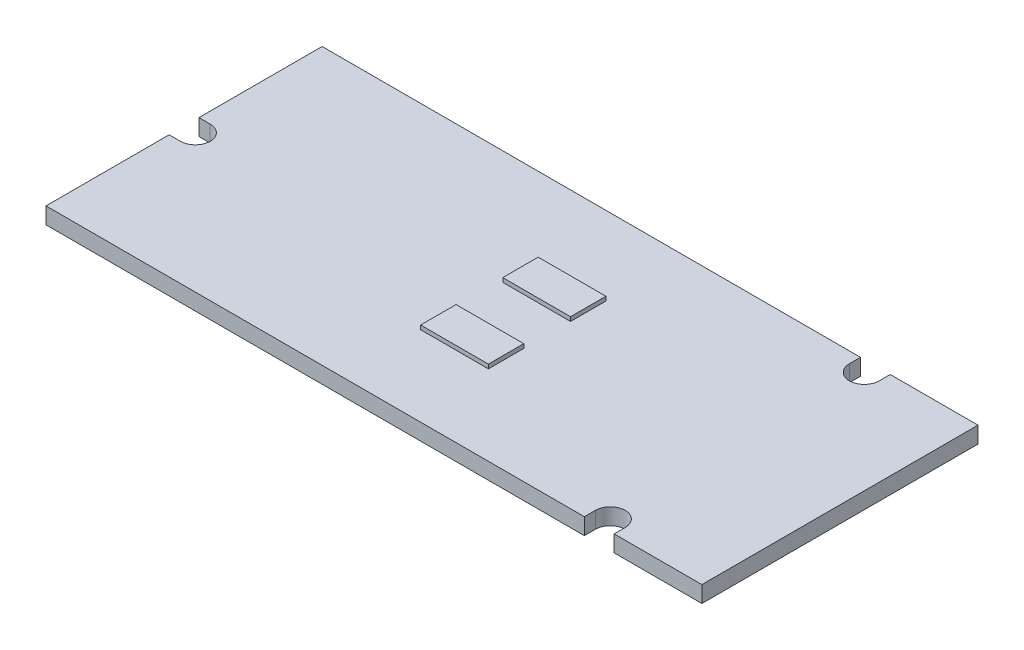
ISO-10303-21;
HEADER;
FILE_DESCRIPTION(('STEP AP214'),'2;1');
FILE_NAME('part.step','',(''),(''),'','','');
FILE_SCHEMA(('AUTOMOTIVE_DESIGN { 1 0 10303 214 1 1 1 1 }'));
ENDSEC;
DATA;
#1=APPLICATION_CONTEXT('core data for automotive mechanical design processes');
#2=APPLICATION_PROTOCOL_DEFINITION('international standard','automotive_design',2000,#1);
#3=PRODUCT_CONTEXT('',#1,'mechanical');
#4=PRODUCT('Part','Part','',(#3));
#5=PRODUCT_RELATED_PRODUCT_CATEGORY('part','',(#4));
#6=PRODUCT_DEFINITION_FORMATION('','',#4);
#7=PRODUCT_DEFINITION_CONTEXT('part definition',#1,'design');
#8=PRODUCT_DEFINITION('design','',#6,#7);
#9=PRODUCT_DEFINITION_SHAPE('','',#8);
#10=(LENGTH_UNIT() NAMED_UNIT(*) SI_UNIT(.MILLI.,.METRE.));
#11=(NAMED_UNIT(*) PLANE_ANGLE_UNIT() SI_UNIT($,.RADIAN.));
#12=(NAMED_UNIT(*) SI_UNIT($,.STERADIAN.) SOLID_ANGLE_UNIT());
#13=UNCERTAINTY_MEASURE_WITH_UNIT(LENGTH_MEASURE(1.E-05),#10,'distance_accuracy_value','');
#14=(GEOMETRIC_REPRESENTATION_CONTEXT(3) GLOBAL_UNCERTAINTY_ASSIGNED_CONTEXT((#13)) GLOBAL_UNIT_ASSIGNED_CONTEXT((#10,
#11,#12)) REPRESENTATION_CONTEXT('',''));
#15=CARTESIAN_POINT('',(0.,0.,0.));
#16=DIRECTION('',(0.,0.,1.));
#17=DIRECTION('',(1.,0.,0.));
#18=AXIS2_PLACEMENT_3D('',#15,#16,#17);
#19=CARTESIAN_POINT('',(21.95,1.6,-12.375));
#20=DIRECTION('',(0.,1.,0.));
#21=DIRECTION('',(0.,0.,1.));
#22=AXIS2_PLACEMENT_3D('',#19,#20,#21);
#23=PLANE('',#22);
#24=DIRECTION('',(-1.,0.,0.));
#25=VECTOR('',#24,1.);
#26=CARTESIAN_POINT('',(-3.24999999999999,1.6,-5.80000000000001));
#27=LINE('',#26,#25);
#28=CARTESIAN_POINT('',(3.35000000000001,1.6,-5.80000000000001));
#29=VERTEX_POINT('',#28);
#30=CARTESIAN_POINT('',(-3.24999999999999,1.6,-5.80000000000001));
#31=VERTEX_POINT('',#30);
#32=EDGE_CURVE('E223',#29,#31,#27,.T.);
#33=ORIENTED_EDGE('',*,*,#32,.F.);
#34=DIRECTION('',(0.,0.,-1.));
#35=VECTOR('',#34,1.);
#36=CARTESIAN_POINT('',(3.35000000000001,1.6,-2.35000000000001));
#37=LINE('',#36,#35);
#38=CARTESIAN_POINT('',(3.35000000000001,1.6,-2.35000000000001));
#39=VERTEX_POINT('',#38);
#40=EDGE_CURVE('E220',#39,#29,#37,.T.);
#41=ORIENTED_EDGE('',*,*,#40,.F.);
#42=DIRECTION('',(1.,0.,0.));
#43=VECTOR('',#42,1.);
#44=CARTESIAN_POINT('',(-3.24999999999999,1.6,-2.35000000000001));
#45=LINE('',#44,#43);
#46=CARTESIAN_POINT('',(-3.24999999999999,1.6,-2.35000000000001));
#47=VERTEX_POINT('',#46);
#48=EDGE_CURVE('E232',#47,#39,#45,.T.);
#49=ORIENTED_EDGE('',*,*,#48,.F.);
#50=DIRECTION('',(0.,0.,1.));
#51=VECTOR('',#50,1.);
#52=CARTESIAN_POINT('',(-3.24999999999999,1.6,-2.35000000000001));
#53=LINE('',#52,#51);
#54=EDGE_CURVE('E240',#31,#47,#53,.T.);
#55=ORIENTED_EDGE('',*,*,#54,.F.);
#56=EDGE_LOOP('',(#33,#41,#49,#55));
#57=FACE_BOUND('',#56,.T.);
#58=DIRECTION('',(0.,0.,1.));
#59=VECTOR('',#58,1.);
#60=CARTESIAN_POINT('',(-31.95,1.6,-1.45));
#61=LINE('',#60,#59);
#62=CARTESIAN_POINT('',(-31.95,1.6,-13.45));
#63=VERTEX_POINT('',#62);
#64=CARTESIAN_POINT('',(-31.95,1.6,-1.45));
#65=VERTEX_POINT('',#64);
#66=EDGE_CURVE('E252',#63,#65,#61,.T.);
#67=ORIENTED_EDGE('',*,*,#66,.T.);
#68=DIRECTION('',(1.,0.,0.));
#69=VECTOR('',#68,1.);
#70=CARTESIAN_POINT('',(-30.85,1.6,-1.45));
#71=LINE('',#70,#69);
#72=CARTESIAN_POINT('',(-30.85,1.6,-1.45));
#73=VERTEX_POINT('',#72);
#74=EDGE_CURVE('E255',#65,#73,#71,.T.);
#75=ORIENTED_EDGE('',*,*,#74,.T.);
#76=CARTESIAN_POINT('',(-30.85,1.6,0.));
#77=DIRECTION('',(0.,-1.,0.));
#78=DIRECTION('',(0.,0.,1.));
#79=AXIS2_PLACEMENT_3D('',#76,#77,#78);
#80=CIRCLE('',#79,1.45);
#81=CARTESIAN_POINT('',(-30.85,1.6,1.45));
#82=VERTEX_POINT('',#81);
#83=EDGE_CURVE('E258',#73,#82,#80,.T.);
#84=ORIENTED_EDGE('',*,*,#83,.T.);
#85=DIRECTION('',(-1.,0.,0.));
#86=VECTOR('',#85,1.);
#87=CARTESIAN_POINT('',(-30.85,1.6,1.45));
#88=LINE('',#87,#86);
#89=CARTESIAN_POINT('',(-31.95,1.6,1.45));
#90=VERTEX_POINT('',#89);
#91=EDGE_CURVE('E260',#82,#90,#88,.T.);
#92=ORIENTED_EDGE('',*,*,#91,.T.);
#93=DIRECTION('',(0.,0.,1.));
#94=VECTOR('',#93,1.);
#95=CARTESIAN_POINT('',(-31.95,1.6,13.45));
#96=LINE('',#95,#94);
#97=CARTESIAN_POINT('',(-31.95,1.6,13.45));
#98=VERTEX_POINT('',#97);
#99=EDGE_CURVE('E262',#90,#98,#96,.T.);
#100=ORIENTED_EDGE('',*,*,#99,.T.);
#101=DIRECTION('',(1.,0.,0.));
#102=VECTOR('',#101,1.);
#103=CARTESIAN_POINT('',(20.5,1.6,13.45));
#104=LINE('',#103,#102);
#105=CARTESIAN_POINT('',(20.5,1.6,13.45));
#106=VERTEX_POINT('',#105);
#107=EDGE_CURVE('E264',#98,#106,#104,.T.);
#108=ORIENTED_EDGE('',*,*,#107,.T.);
#109=DIRECTION('',(0.,0.,-1.));
#110=VECTOR('',#109,1.);
#111=CARTESIAN_POINT('',(20.5,1.6,12.375));
#112=LINE('',#111,#110);
#113=CARTESIAN_POINT('',(20.5,1.6,12.375));
#114=VERTEX_POINT('',#113);
#115=EDGE_CURVE('E266',#106,#114,#112,.T.);
#116=ORIENTED_EDGE('',*,*,#115,.T.);
#117=CARTESIAN_POINT('',(21.95,1.6,12.375));
#118=DIRECTION('',(0.,-1.,0.));
#119=DIRECTION('',(0.,0.,-1.));
#120=AXIS2_PLACEMENT_3D('',#117,#118,#119);
#121=CIRCLE('',#120,1.45);
#122=CARTESIAN_POINT('',(23.4,1.6,12.375));
#123=VERTEX_POINT('',#122);
#124=EDGE_CURVE('E268',#114,#123,#121,.T.);
#125=ORIENTED_EDGE('',*,*,#124,.T.);
#126=DIRECTION('',(0.,0.,1.));
#127=VECTOR('',#126,1.);
#128=CARTESIAN_POINT('',(23.4,1.6,12.375));
#129=LINE('',#128,#127);
#130=CARTESIAN_POINT('',(23.4,1.6,13.45));
#131=VERTEX_POINT('',#130);
#132=EDGE_CURVE('E270',#123,#131,#129,.T.);
#133=ORIENTED_EDGE('',*,*,#132,.T.);
#134=DIRECTION('',(1.,0.,0.));
#135=VECTOR('',#134,1.);
#136=CARTESIAN_POINT('',(31.95,1.6,13.45));
#137=LINE('',#136,#135);
#138=CARTESIAN_POINT('',(31.95,1.6,13.45));
#139=VERTEX_POINT('',#138);
#140=EDGE_CURVE('E272',#131,#139,#137,.T.);
#141=ORIENTED_EDGE('',*,*,#140,.T.);
#142=DIRECTION('',(0.,0.,-1.));
#143=VECTOR('',#142,1.);
#144=CARTESIAN_POINT('',(31.95,1.6,13.45));
#145=LINE('',#144,#143);
#146=CARTESIAN_POINT('',(31.95,1.6,-13.45));
#147=VERTEX_POINT('',#146);
#148=EDGE_CURVE('E274',#139,#147,#145,.T.);
#149=ORIENTED_EDGE('',*,*,#148,.T.);
#150=DIRECTION('',(-1.,0.,0.));
#151=VECTOR('',#150,1.);
#152=CARTESIAN_POINT('',(31.95,1.6,-13.45));
#153=LINE('',#152,#151);
#154=CARTESIAN_POINT('',(23.4,1.6,-13.45));
#155=VERTEX_POINT('',#154);
#156=EDGE_CURVE('E276',#147,#155,#153,.T.);
#157=ORIENTED_EDGE('',*,*,#156,.T.);
#158=DIRECTION('',(0.,0.,1.));
#159=VECTOR('',#158,1.);
#160=CARTESIAN_POINT('',(23.4,1.6,-12.375));
#161=LINE('',#160,#159);
#162=CARTESIAN_POINT('',(23.4,1.6,-12.375));
#163=VERTEX_POINT('',#162);
#164=EDGE_CURVE('E278',#155,#163,#161,.T.);
#165=ORIENTED_EDGE('',*,*,#164,.T.);
#166=CARTESIAN_POINT('',(21.95,1.6,-12.375));
#167=DIRECTION('',(0.,-1.,0.));
#168=DIRECTION('',(0.,0.,1.));
#169=AXIS2_PLACEMENT_3D('',#166,#167,#168);
#170=CIRCLE('',#169,1.45);
#171=CARTESIAN_POINT('',(20.5,1.6,-12.375));
#172=VERTEX_POINT('',#171);
#173=EDGE_CURVE('E280',#163,#172,#170,.T.);
#174=ORIENTED_EDGE('',*,*,#173,.T.);
#175=DIRECTION('',(0.,0.,-1.));
#176=VECTOR('',#175,1.);
#177=CARTESIAN_POINT('',(20.5,1.6,-12.375));
#178=LINE('',#177,#176);
#179=CARTESIAN_POINT('',(20.5,1.6,-13.45));
#180=VERTEX_POINT('',#179);
#181=EDGE_CURVE('E282',#172,#180,#178,.T.);
#182=ORIENTED_EDGE('',*,*,#181,.T.);
#183=DIRECTION('',(-1.,0.,0.));
#184=VECTOR('',#183,1.);
#185=CARTESIAN_POINT('',(20.5,1.6,-13.45));
#186=LINE('',#185,#184);
#187=EDGE_CURVE('E284',#180,#63,#186,.T.);
#188=ORIENTED_EDGE('',*,*,#187,.T.);
#189=EDGE_LOOP('',(#67,#75,#84,#92,#100,#108,#116,#125,#133,#141,#149,#157,#165,#174,#182,#188));
#190=FACE_BOUND('',#189,.T.);
#191=DIRECTION('',(-1.,0.,0.));
#192=VECTOR('',#191,1.);
#193=CARTESIAN_POINT('',(-3.2499999999999,1.6,2.19999999999999));
#194=LINE('',#193,#192);
#195=CARTESIAN_POINT('',(3.3500000000001,1.6,2.19999999999999));
#196=VERTEX_POINT('',#195);
#197=CARTESIAN_POINT('',(-3.2499999999999,1.6,2.19999999999999));
#198=VERTEX_POINT('',#197);
#199=EDGE_CURVE('E619',#196,#198,#194,.T.);
#200=ORIENTED_EDGE('',*,*,#199,.F.);
#201=DIRECTION('',(0.,0.,-1.));
#202=VECTOR('',#201,1.);
#203=CARTESIAN_POINT('',(3.3500000000001,1.6,5.64999999999999));
#204=LINE('',#203,#202);
#205=CARTESIAN_POINT('',(3.3500000000001,1.6,5.64999999999999));
#206=VERTEX_POINT('',#205);
#207=EDGE_CURVE('E218',#206,#196,#204,.T.);
#208=ORIENTED_EDGE('',*,*,#207,.F.);
#209=DIRECTION('',(1.,0.,0.));
#210=VECTOR('',#209,1.);
#211=CARTESIAN_POINT('',(-3.2499999999999,1.6,5.64999999999999));
#212=LINE('',#211,#210);
#213=CARTESIAN_POINT('',(-3.2499999999999,1.6,5.64999999999999));
#214=VERTEX_POINT('',#213);
#215=EDGE_CURVE('E214',#214,#206,#212,.T.);
#216=ORIENTED_EDGE('',*,*,#215,.F.);
#217=DIRECTION('',(0.,0.,1.));
#218=VECTOR('',#217,1.);
#219=CARTESIAN_POINT('',(-3.2499999999999,1.6,5.64999999999999));
#220=LINE('',#219,#218);
#221=EDGE_CURVE('E616',#198,#214,#220,.T.);
#222=ORIENTED_EDGE('',*,*,#221,.F.);
#223=EDGE_LOOP('',(#200,#208,#216,#222));
#224=FACE_BOUND('',#223,.T.);
#225=ADVANCED_FACE('F33',(#57,#190,#224),#23,.T.);
#226=CARTESIAN_POINT('',(-31.95,1.6,-1.45));
#227=DIRECTION('',(1.,0.,0.));
#228=DIRECTION('',(0.,0.,-1.));
#229=AXIS2_PLACEMENT_3D('',#226,#227,#228);
#230=PLANE('',#229);
#231=DIRECTION('',(0.,0.,1.));
#232=VECTOR('',#231,1.);
#233=CARTESIAN_POINT('',(-31.95,0.,-1.45));
#234=LINE('',#233,#232);
#235=CARTESIAN_POINT('',(-31.95,0.,-13.45));
#236=VERTEX_POINT('',#235);
#237=CARTESIAN_POINT('',(-31.95,0.,-1.45));
#238=VERTEX_POINT('',#237);
#239=EDGE_CURVE('E251',#236,#238,#234,.T.);
#240=ORIENTED_EDGE('',*,*,#239,.T.);
#241=DIRECTION('',(0.,-1.,0.));
#242=VECTOR('',#241,1.);
#243=CARTESIAN_POINT('',(-31.95,1.6,-1.45));
#244=LINE('',#243,#242);
#245=EDGE_CURVE('E11',#65,#238,#244,.T.);
#246=ORIENTED_EDGE('',*,*,#245,.F.);
#247=ORIENTED_EDGE('',*,*,#66,.F.);
#248=DIRECTION('',(0.,-1.,0.));
#249=VECTOR('',#248,1.);
#250=CARTESIAN_POINT('',(-31.95,1.6,-13.45));
#251=LINE('',#250,#249);
#252=EDGE_CURVE('E286',#63,#236,#251,.T.);
#253=ORIENTED_EDGE('',*,*,#252,.T.);
#254=EDGE_LOOP('',(#240,#246,#247,#253));
#255=FACE_BOUND('',#254,.T.);
#256=ADVANCED_FACE('F35',(#255),#230,.F.);
#257=CARTESIAN_POINT('',(-30.85,1.6,-1.45));
#258=DIRECTION('',(0.,0.,-1.));
#259=DIRECTION('',(-1.,0.,0.));
#260=AXIS2_PLACEMENT_3D('',#257,#258,#259);
#261=PLANE('',#260);
#262=DIRECTION('',(1.,0.,0.));
#263=VECTOR('',#262,1.);
#264=CARTESIAN_POINT('',(-30.85,0.,-1.45));
#265=LINE('',#264,#263);
#266=CARTESIAN_POINT('',(-30.85,0.,-1.45));
#267=VERTEX_POINT('',#266);
#268=EDGE_CURVE('E289',#238,#267,#265,.T.);
#269=ORIENTED_EDGE('',*,*,#268,.T.);
#270=DIRECTION('',(0.,-1.,0.));
#271=VECTOR('',#270,1.);
#272=CARTESIAN_POINT('',(-30.85,1.6,-1.45));
#273=LINE('',#272,#271);
#274=EDGE_CURVE('E41',#73,#267,#273,.T.);
#275=ORIENTED_EDGE('',*,*,#274,.F.);
#276=ORIENTED_EDGE('',*,*,#74,.F.);
#277=ORIENTED_EDGE('',*,*,#245,.T.);
#278=EDGE_LOOP('',(#269,#275,#276,#277));
#279=FACE_BOUND('',#278,.T.);
#280=ADVANCED_FACE('F386',(#279),#261,.F.);
#281=CARTESIAN_POINT('',(-30.85,1.6,0.));
#282=DIRECTION('',(0.,-1.,0.));
#283=DIRECTION('',(0.,0.,-1.));
#284=AXIS2_PLACEMENT_3D('',#281,#282,#283);
#285=CYLINDRICAL_SURFACE('',#284,1.45);
#286=CARTESIAN_POINT('',(-30.85,0.,0.));
#287=DIRECTION('',(0.,-1.,0.));
#288=DIRECTION('',(0.,0.,1.));
#289=AXIS2_PLACEMENT_3D('',#286,#287,#288);
#290=CIRCLE('',#289,1.45);
#291=CARTESIAN_POINT('',(-30.85,0.,1.45));
#292=VERTEX_POINT('',#291);
#293=EDGE_CURVE('E291',#267,#292,#290,.T.);
#294=ORIENTED_EDGE('',*,*,#293,.T.);
#295=DIRECTION('',(0.,-1.,0.));
#296=VECTOR('',#295,1.);
#297=CARTESIAN_POINT('',(-30.85,1.6,1.45));
#298=LINE('',#297,#296);
#299=EDGE_CURVE('E356',#82,#292,#298,.T.);
#300=ORIENTED_EDGE('',*,*,#299,.F.);
#301=ORIENTED_EDGE('',*,*,#83,.F.);
#302=ORIENTED_EDGE('',*,*,#274,.T.);
#303=EDGE_LOOP('',(#294,#300,#301,#302));
#304=FACE_BOUND('',#303,.T.);
#305=ADVANCED_FACE('F363',(#304),#285,.F.);
#306=CARTESIAN_POINT('',(-30.85,1.6,1.45));
#307=DIRECTION('',(0.,0.,1.));
#308=DIRECTION('',(1.,0.,0.));
#309=AXIS2_PLACEMENT_3D('',#306,#307,#308);
#310=PLANE('',#309);
#311=DIRECTION('',(-1.,0.,0.));
#312=VECTOR('',#311,1.);
#313=CARTESIAN_POINT('',(-30.85,0.,1.45));
#314=LINE('',#313,#312);
#315=CARTESIAN_POINT('',(-31.95,0.,1.45));
#316=VERTEX_POINT('',#315);
#317=EDGE_CURVE('E293',#292,#316,#314,.T.);
#318=ORIENTED_EDGE('',*,*,#317,.T.);
#319=DIRECTION('',(0.,-1.,0.));
#320=VECTOR('',#319,1.);
#321=CARTESIAN_POINT('',(-31.95,1.6,1.45));
#322=LINE('',#321,#320);
#323=EDGE_CURVE('E353',#90,#316,#322,.T.);
#324=ORIENTED_EDGE('',*,*,#323,.F.);
#325=ORIENTED_EDGE('',*,*,#91,.F.);
#326=ORIENTED_EDGE('',*,*,#299,.T.);
#327=EDGE_LOOP('',(#318,#324,#325,#326));
#328=FACE_BOUND('',#327,.T.);
#329=ADVANCED_FACE('F374',(#328),#310,.F.);
#330=CARTESIAN_POINT('',(-31.95,1.6,13.45));
#331=DIRECTION('',(1.,0.,0.));
#332=DIRECTION('',(0.,0.,-1.));
#333=AXIS2_PLACEMENT_3D('',#330,#331,#332);
#334=PLANE('',#333);
#335=DIRECTION('',(0.,0.,1.));
#336=VECTOR('',#335,1.);
#337=CARTESIAN_POINT('',(-31.95,0.,13.45));
#338=LINE('',#337,#336);
#339=CARTESIAN_POINT('',(-31.95,0.,13.45));
#340=VERTEX_POINT('',#339);
#341=EDGE_CURVE('E295',#316,#340,#338,.T.);
#342=ORIENTED_EDGE('',*,*,#341,.T.);
#343=DIRECTION('',(0.,-1.,0.));
#344=VECTOR('',#343,1.);
#345=CARTESIAN_POINT('',(-31.95,1.6,13.45));
#346=LINE('',#345,#344);
#347=EDGE_CURVE('E350',#98,#340,#346,.T.);
#348=ORIENTED_EDGE('',*,*,#347,.F.);
#349=ORIENTED_EDGE('',*,*,#99,.F.);
#350=ORIENTED_EDGE('',*,*,#323,.T.);
#351=EDGE_LOOP('',(#342,#348,#349,#350));
#352=FACE_BOUND('',#351,.T.);
#353=ADVANCED_FACE('F378',(#352),#334,.F.);
#354=CARTESIAN_POINT('',(20.5,1.6,13.45));
#355=DIRECTION('',(0.,0.,-1.));
#356=DIRECTION('',(-1.,0.,0.));
#357=AXIS2_PLACEMENT_3D('',#354,#355,#356);
#358=PLANE('',#357);
#359=DIRECTION('',(1.,0.,0.));
#360=VECTOR('',#359,1.);
#361=CARTESIAN_POINT('',(20.5,0.,13.45));
#362=LINE('',#361,#360);
#363=CARTESIAN_POINT('',(20.5,0.,13.45));
#364=VERTEX_POINT('',#363);
#365=EDGE_CURVE('E297',#340,#364,#362,.T.);
#366=ORIENTED_EDGE('',*,*,#365,.T.);
#367=DIRECTION('',(0.,-1.,0.));
#368=VECTOR('',#367,1.);
#369=CARTESIAN_POINT('',(20.5,1.6,13.45));
#370=LINE('',#369,#368);
#371=EDGE_CURVE('E347',#106,#364,#370,.T.);
#372=ORIENTED_EDGE('',*,*,#371,.F.);
#373=ORIENTED_EDGE('',*,*,#107,.F.);
#374=ORIENTED_EDGE('',*,*,#347,.T.);
#375=EDGE_LOOP('',(#366,#372,#373,#374));
#376=FACE_BOUND('',#375,.T.);
#377=ADVANCED_FACE('F439',(#376),#358,.F.);
#378=CARTESIAN_POINT('',(20.5,1.6,12.375));
#379=DIRECTION('',(-1.,0.,0.));
#380=DIRECTION('',(0.,0.,1.));
#381=AXIS2_PLACEMENT_3D('',#378,#379,#380);
#382=PLANE('',#381);
#383=DIRECTION('',(0.,0.,-1.));
#384=VECTOR('',#383,1.);
#385=CARTESIAN_POINT('',(20.5,0.,12.375));
#386=LINE('',#385,#384);
#387=CARTESIAN_POINT('',(20.5,0.,12.375));
#388=VERTEX_POINT('',#387);
#389=EDGE_CURVE('E299',#364,#388,#386,.T.);
#390=ORIENTED_EDGE('',*,*,#389,.T.);
#391=DIRECTION('',(0.,-1.,0.));
#392=VECTOR('',#391,1.);
#393=CARTESIAN_POINT('',(20.5,1.6,12.375));
#394=LINE('',#393,#392);
#395=EDGE_CURVE('E344',#114,#388,#394,.T.);
#396=ORIENTED_EDGE('',*,*,#395,.F.);
#397=ORIENTED_EDGE('',*,*,#115,.F.);
#398=ORIENTED_EDGE('',*,*,#371,.T.);
#399=EDGE_LOOP('',(#390,#396,#397,#398));
#400=FACE_BOUND('',#399,.T.);
#401=ADVANCED_FACE('F436',(#400),#382,.F.);
#402=CARTESIAN_POINT('',(21.95,1.6,12.375));
#403=DIRECTION('',(0.,-1.,0.));
#404=DIRECTION('',(0.,0.,-1.));
#405=AXIS2_PLACEMENT_3D('',#402,#403,#404);
#406=CYLINDRICAL_SURFACE('',#405,1.45);
#407=CARTESIAN_POINT('',(21.95,0.,12.375));
#408=DIRECTION('',(0.,-1.,0.));
#409=DIRECTION('',(0.,0.,-1.));
#410=AXIS2_PLACEMENT_3D('',#407,#408,#409);
#411=CIRCLE('',#410,1.45);
#412=CARTESIAN_POINT('',(23.4,0.,12.375));
#413=VERTEX_POINT('',#412);
#414=EDGE_CURVE('E301',#388,#413,#411,.T.);
#415=ORIENTED_EDGE('',*,*,#414,.T.);
#416=DIRECTION('',(0.,-1.,0.));
#417=VECTOR('',#416,1.);
#418=CARTESIAN_POINT('',(23.4,1.6,12.375));
#419=LINE('',#418,#417);
#420=EDGE_CURVE('E341',#123,#413,#419,.T.);
#421=ORIENTED_EDGE('',*,*,#420,.F.);
#422=ORIENTED_EDGE('',*,*,#124,.F.);
#423=ORIENTED_EDGE('',*,*,#395,.T.);
#424=EDGE_LOOP('',(#415,#421,#422,#423));
#425=FACE_BOUND('',#424,.T.);
#426=ADVANCED_FACE('F432',(#425),#406,.F.);
#427=CARTESIAN_POINT('',(23.4,1.6,12.375));
#428=DIRECTION('',(1.,0.,0.));
#429=DIRECTION('',(0.,0.,-1.));
#430=AXIS2_PLACEMENT_3D('',#427,#428,#429);
#431=PLANE('',#430);
#432=DIRECTION('',(0.,0.,1.));
#433=VECTOR('',#432,1.);
#434=CARTESIAN_POINT('',(23.4,0.,12.375));
#435=LINE('',#434,#433);
#436=CARTESIAN_POINT('',(23.4,0.,13.45));
#437=VERTEX_POINT('',#436);
#438=EDGE_CURVE('E303',#413,#437,#435,.T.);
#439=ORIENTED_EDGE('',*,*,#438,.T.);
#440=DIRECTION('',(0.,-1.,0.));
#441=VECTOR('',#440,1.);
#442=CARTESIAN_POINT('',(23.4,1.6,13.45));
#443=LINE('',#442,#441);
#444=EDGE_CURVE('E338',#131,#437,#443,.T.);
#445=ORIENTED_EDGE('',*,*,#444,.F.);
#446=ORIENTED_EDGE('',*,*,#132,.F.);
#447=ORIENTED_EDGE('',*,*,#420,.T.);
#448=EDGE_LOOP('',(#439,#445,#446,#447));
#449=FACE_BOUND('',#448,.T.);
#450=ADVANCED_FACE('F428',(#449),#431,.F.);
#451=CARTESIAN_POINT('',(31.95,1.6,13.45));
#452=DIRECTION('',(0.,0.,-1.));
#453=DIRECTION('',(-1.,0.,0.));
#454=AXIS2_PLACEMENT_3D('',#451,#452,#453);
#455=PLANE('',#454);
#456=DIRECTION('',(1.,0.,0.));
#457=VECTOR('',#456,1.);
#458=CARTESIAN_POINT('',(31.95,0.,13.45));
#459=LINE('',#458,#457);
#460=CARTESIAN_POINT('',(31.95,0.,13.45));
#461=VERTEX_POINT('',#460);
#462=EDGE_CURVE('E305',#437,#461,#459,.T.);
#463=ORIENTED_EDGE('',*,*,#462,.T.);
#464=DIRECTION('',(0.,-1.,0.));
#465=VECTOR('',#464,1.);
#466=CARTESIAN_POINT('',(31.95,1.6,13.45));
#467=LINE('',#466,#465);
#468=EDGE_CURVE('E335',#139,#461,#467,.T.);
#469=ORIENTED_EDGE('',*,*,#468,.F.);
#470=ORIENTED_EDGE('',*,*,#140,.F.);
#471=ORIENTED_EDGE('',*,*,#444,.T.);
#472=EDGE_LOOP('',(#463,#469,#470,#471));
#473=FACE_BOUND('',#472,.T.);
#474=ADVANCED_FACE('F423',(#473),#455,.F.);
#475=CARTESIAN_POINT('',(31.95,1.6,13.45));
#476=DIRECTION('',(-1.,0.,0.));
#477=DIRECTION('',(0.,0.,1.));
#478=AXIS2_PLACEMENT_3D('',#475,#476,#477);
#479=PLANE('',#478);
#480=DIRECTION('',(0.,0.,-1.));
#481=VECTOR('',#480,1.);
#482=CARTESIAN_POINT('',(31.95,0.,13.45));
#483=LINE('',#482,#481);
#484=CARTESIAN_POINT('',(31.95,0.,-13.45));
#485=VERTEX_POINT('',#484);
#486=EDGE_CURVE('E307',#461,#485,#483,.T.);
#487=ORIENTED_EDGE('',*,*,#486,.T.);
#488=DIRECTION('',(0.,-1.,0.));
#489=VECTOR('',#488,1.);
#490=CARTESIAN_POINT('',(31.95,1.6,-13.45));
#491=LINE('',#490,#489);
#492=EDGE_CURVE('E332',#147,#485,#491,.T.);
#493=ORIENTED_EDGE('',*,*,#492,.F.);
#494=ORIENTED_EDGE('',*,*,#148,.F.);
#495=ORIENTED_EDGE('',*,*,#468,.T.);
#496=EDGE_LOOP('',(#487,#493,#494,#495));
#497=FACE_BOUND('',#496,.T.);
#498=ADVANCED_FACE('F417',(#497),#479,.F.);
#499=CARTESIAN_POINT('',(31.95,1.6,-13.45));
#500=DIRECTION('',(0.,0.,1.));
#501=DIRECTION('',(1.,0.,0.));
#502=AXIS2_PLACEMENT_3D('',#499,#500,#501);
#503=PLANE('',#502);
#504=DIRECTION('',(-1.,0.,0.));
#505=VECTOR('',#504,1.);
#506=CARTESIAN_POINT('',(31.95,0.,-13.45));
#507=LINE('',#506,#505);
#508=CARTESIAN_POINT('',(23.4,0.,-13.45));
#509=VERTEX_POINT('',#508);
#510=EDGE_CURVE('E309',#485,#509,#507,.T.);
#511=ORIENTED_EDGE('',*,*,#510,.T.);
#512=DIRECTION('',(0.,-1.,0.));
#513=VECTOR('',#512,1.);
#514=CARTESIAN_POINT('',(23.4,1.6,-13.45));
#515=LINE('',#514,#513);
#516=EDGE_CURVE('E329',#155,#509,#515,.T.);
#517=ORIENTED_EDGE('',*,*,#516,.F.);
#518=ORIENTED_EDGE('',*,*,#156,.F.);
#519=ORIENTED_EDGE('',*,*,#492,.T.);
#520=EDGE_LOOP('',(#511,#517,#518,#519));
#521=FACE_BOUND('',#520,.T.);
#522=ADVANCED_FACE('F413',(#521),#503,.F.);
#523=CARTESIAN_POINT('',(23.4,1.6,-12.375));
#524=DIRECTION('',(1.,0.,0.));
#525=DIRECTION('',(0.,0.,-1.));
#526=AXIS2_PLACEMENT_3D('',#523,#524,#525);
#527=PLANE('',#526);
#528=DIRECTION('',(0.,0.,1.));
#529=VECTOR('',#528,1.);
#530=CARTESIAN_POINT('',(23.4,0.,-12.375));
#531=LINE('',#530,#529);
#532=CARTESIAN_POINT('',(23.4,0.,-12.375));
#533=VERTEX_POINT('',#532);
#534=EDGE_CURVE('E311',#509,#533,#531,.T.);
#535=ORIENTED_EDGE('',*,*,#534,.T.);
#536=DIRECTION('',(0.,-1.,0.));
#537=VECTOR('',#536,1.);
#538=CARTESIAN_POINT('',(23.4,1.6,-12.375));
#539=LINE('',#538,#537);
#540=EDGE_CURVE('E326',#163,#533,#539,.T.);
#541=ORIENTED_EDGE('',*,*,#540,.F.);
#542=ORIENTED_EDGE('',*,*,#164,.F.);
#543=ORIENTED_EDGE('',*,*,#516,.T.);
#544=EDGE_LOOP('',(#535,#541,#542,#543));
#545=FACE_BOUND('',#544,.T.);
#546=ADVANCED_FACE('F408',(#545),#527,.F.);
#547=CARTESIAN_POINT('',(21.95,1.6,-12.375));
#548=DIRECTION('',(0.,-1.,0.));
#549=DIRECTION('',(0.,0.,-1.));
#550=AXIS2_PLACEMENT_3D('',#547,#548,#549);
#551=CYLINDRICAL_SURFACE('',#550,1.45);
#552=CARTESIAN_POINT('',(21.95,0.,-12.375));
#553=DIRECTION('',(0.,-1.,0.));
#554=DIRECTION('',(0.,0.,1.));
#555=AXIS2_PLACEMENT_3D('',#552,#553,#554);
#556=CIRCLE('',#555,1.45);
#557=CARTESIAN_POINT('',(20.5,0.,-12.375));
#558=VERTEX_POINT('',#557);
#559=EDGE_CURVE('E313',#533,#558,#556,.T.);
#560=ORIENTED_EDGE('',*,*,#559,.T.);
#561=DIRECTION('',(0.,-1.,0.));
#562=VECTOR('',#561,1.);
#563=CARTESIAN_POINT('',(20.5,1.6,-12.375));
#564=LINE('',#563,#562);
#565=EDGE_CURVE('E323',#172,#558,#564,.T.);
#566=ORIENTED_EDGE('',*,*,#565,.F.);
#567=ORIENTED_EDGE('',*,*,#173,.F.);
#568=ORIENTED_EDGE('',*,*,#540,.T.);
#569=EDGE_LOOP('',(#560,#566,#567,#568));
#570=FACE_BOUND('',#569,.T.);
#571=ADVANCED_FACE('F402',(#570),#551,.F.);
#572=CARTESIAN_POINT('',(20.5,1.6,-12.375));
#573=DIRECTION('',(-1.,0.,0.));
#574=DIRECTION('',(0.,0.,1.));
#575=AXIS2_PLACEMENT_3D('',#572,#573,#574);
#576=PLANE('',#575);
#577=DIRECTION('',(0.,0.,-1.));
#578=VECTOR('',#577,1.);
#579=CARTESIAN_POINT('',(20.5,0.,-12.375));
#580=LINE('',#579,#578);
#581=CARTESIAN_POINT('',(20.5,0.,-13.45));
#582=VERTEX_POINT('',#581);
#583=EDGE_CURVE('E315',#558,#582,#580,.T.);
#584=ORIENTED_EDGE('',*,*,#583,.T.);
#585=DIRECTION('',(0.,-1.,0.));
#586=VECTOR('',#585,1.);
#587=CARTESIAN_POINT('',(20.5,1.6,-13.45));
#588=LINE('',#587,#586);
#589=EDGE_CURVE('E320',#180,#582,#588,.T.);
#590=ORIENTED_EDGE('',*,*,#589,.F.);
#591=ORIENTED_EDGE('',*,*,#181,.F.);
#592=ORIENTED_EDGE('',*,*,#565,.T.);
#593=EDGE_LOOP('',(#584,#590,#591,#592));
#594=FACE_BOUND('',#593,.T.);
#595=ADVANCED_FACE('F398',(#594),#576,.F.);
#596=CARTESIAN_POINT('',(20.5,1.6,-13.45));
#597=DIRECTION('',(0.,0.,1.));
#598=DIRECTION('',(1.,0.,0.));
#599=AXIS2_PLACEMENT_3D('',#596,#597,#598);
#600=PLANE('',#599);
#601=DIRECTION('',(-1.,0.,0.));
#602=VECTOR('',#601,1.);
#603=CARTESIAN_POINT('',(20.5,0.,-13.45));
#604=LINE('',#603,#602);
#605=EDGE_CURVE('E256',#582,#236,#604,.T.);
#606=ORIENTED_EDGE('',*,*,#605,.T.);
#607=ORIENTED_EDGE('',*,*,#252,.F.);
#608=ORIENTED_EDGE('',*,*,#187,.F.);
#609=ORIENTED_EDGE('',*,*,#589,.T.);
#610=EDGE_LOOP('',(#606,#607,#608,#609));
#611=FACE_BOUND('',#610,.T.);
#612=ADVANCED_FACE('F393',(#611),#600,.F.);
#613=CARTESIAN_POINT('',(21.95,0.,-12.375));
#614=DIRECTION('',(0.,1.,0.));
#615=DIRECTION('',(0.,0.,1.));
#616=AXIS2_PLACEMENT_3D('',#613,#614,#615);
#617=PLANE('',#616);
#618=ORIENTED_EDGE('',*,*,#239,.F.);
#619=ORIENTED_EDGE('',*,*,#605,.F.);
#620=ORIENTED_EDGE('',*,*,#583,.F.);
#621=ORIENTED_EDGE('',*,*,#559,.F.);
#622=ORIENTED_EDGE('',*,*,#534,.F.);
#623=ORIENTED_EDGE('',*,*,#510,.F.);
#624=ORIENTED_EDGE('',*,*,#486,.F.);
#625=ORIENTED_EDGE('',*,*,#462,.F.);
#626=ORIENTED_EDGE('',*,*,#438,.F.);
#627=ORIENTED_EDGE('',*,*,#414,.F.);
#628=ORIENTED_EDGE('',*,*,#389,.F.);
#629=ORIENTED_EDGE('',*,*,#365,.F.);
#630=ORIENTED_EDGE('',*,*,#341,.F.);
#631=ORIENTED_EDGE('',*,*,#317,.F.);
#632=ORIENTED_EDGE('',*,*,#293,.F.);
#633=ORIENTED_EDGE('',*,*,#268,.F.);
#634=EDGE_LOOP('',(#618,#619,#620,#621,#622,#623,#624,#625,#626,#627,#628,#629,#630,#631,#632,#633));
#635=FACE_BOUND('',#634,.T.);
#636=ADVANCED_FACE('F369',(#635),#617,.F.);
#637=CARTESIAN_POINT('',(3.35000000000001,2.,-2.35000000000001));
#638=DIRECTION('',(-1.,0.,0.));
#639=DIRECTION('',(0.,0.,1.));
#640=AXIS2_PLACEMENT_3D('',#637,#638,#639);
#641=PLANE('',#640);
#642=ORIENTED_EDGE('',*,*,#40,.T.);
#643=DIRECTION('',(0.,-1.,0.));
#644=VECTOR('',#643,1.);
#645=CARTESIAN_POINT('',(3.35000000000001,2.,-5.80000000000001));
#646=LINE('',#645,#644);
#647=CARTESIAN_POINT('',(3.35000000000001,2.,-5.80000000000001));
#648=VERTEX_POINT('',#647);
#649=EDGE_CURVE('E249',#648,#29,#646,.T.);
#650=ORIENTED_EDGE('',*,*,#649,.F.);
#651=DIRECTION('',(0.,0.,-1.));
#652=VECTOR('',#651,1.);
#653=CARTESIAN_POINT('',(3.35000000000001,2.,-2.35000000000001));
#654=LINE('',#653,#652);
#655=CARTESIAN_POINT('',(3.35000000000001,2.,-2.35000000000001));
#656=VERTEX_POINT('',#655);
#657=EDGE_CURVE('E228',#656,#648,#654,.T.);
#658=ORIENTED_EDGE('',*,*,#657,.F.);
#659=DIRECTION('',(0.,-1.,0.));
#660=VECTOR('',#659,1.);
#661=CARTESIAN_POINT('',(3.35000000000001,2.,-2.35000000000001));
#662=LINE('',#661,#660);
#663=EDGE_CURVE('E237',#656,#39,#662,.T.);
#664=ORIENTED_EDGE('',*,*,#663,.T.);
#665=EDGE_LOOP('',(#642,#650,#658,#664));
#666=FACE_BOUND('',#665,.T.);
#667=ADVANCED_FACE('F459',(#666),#641,.F.);
#668=CARTESIAN_POINT('',(-3.24999999999999,2.,-5.80000000000001));
#669=DIRECTION('',(0.,0.,1.));
#670=DIRECTION('',(1.,0.,0.));
#671=AXIS2_PLACEMENT_3D('',#668,#669,#670);
#672=PLANE('',#671);
#673=ORIENTED_EDGE('',*,*,#32,.T.);
#674=DIRECTION('',(0.,-1.,0.));
#675=VECTOR('',#674,1.);
#676=CARTESIAN_POINT('',(-3.24999999999999,2.,-5.80000000000001));
#677=LINE('',#676,#675);
#678=CARTESIAN_POINT('',(-3.24999999999999,2.,-5.80000000000001));
#679=VERTEX_POINT('',#678);
#680=EDGE_CURVE('E246',#679,#31,#677,.T.);
#681=ORIENTED_EDGE('',*,*,#680,.F.);
#682=DIRECTION('',(-1.,0.,0.));
#683=VECTOR('',#682,1.);
#684=CARTESIAN_POINT('',(-3.24999999999999,2.,-5.80000000000001));
#685=LINE('',#684,#683);
#686=EDGE_CURVE('E231',#648,#679,#685,.T.);
#687=ORIENTED_EDGE('',*,*,#686,.F.);
#688=ORIENTED_EDGE('',*,*,#649,.T.);
#689=EDGE_LOOP('',(#673,#681,#687,#688));
#690=FACE_BOUND('',#689,.T.);
#691=ADVANCED_FACE('F529',(#690),#672,.F.);
#692=CARTESIAN_POINT('',(-3.24999999999999,2.,-2.35000000000001));
#693=DIRECTION('',(1.,0.,0.));
#694=DIRECTION('',(0.,0.,-1.));
#695=AXIS2_PLACEMENT_3D('',#692,#693,#694);
#696=PLANE('',#695);
#697=ORIENTED_EDGE('',*,*,#54,.T.);
#698=DIRECTION('',(0.,-1.,0.));
#699=VECTOR('',#698,1.);
#700=CARTESIAN_POINT('',(-3.24999999999999,2.,-2.35000000000001));
#701=LINE('',#700,#699);
#702=CARTESIAN_POINT('',(-3.24999999999999,2.,-2.35000000000001));
#703=VERTEX_POINT('',#702);
#704=EDGE_CURVE('E56',#703,#47,#701,.T.);
#705=ORIENTED_EDGE('',*,*,#704,.F.);
#706=DIRECTION('',(0.,0.,1.));
#707=VECTOR('',#706,1.);
#708=CARTESIAN_POINT('',(-3.24999999999999,2.,-2.35000000000001));
#709=LINE('',#708,#707);
#710=EDGE_CURVE('E234',#679,#703,#709,.T.);
#711=ORIENTED_EDGE('',*,*,#710,.F.);
#712=ORIENTED_EDGE('',*,*,#680,.T.);
#713=EDGE_LOOP('',(#697,#705,#711,#712));
#714=FACE_BOUND('',#713,.T.);
#715=ADVANCED_FACE('F535',(#714),#696,.F.);
#716=CARTESIAN_POINT('',(-3.24999999999999,2.,-2.35000000000001));
#717=DIRECTION('',(0.,0.,-1.));
#718=DIRECTION('',(-1.,0.,0.));
#719=AXIS2_PLACEMENT_3D('',#716,#717,#718);
#720=PLANE('',#719);
#721=ORIENTED_EDGE('',*,*,#48,.T.);
#722=ORIENTED_EDGE('',*,*,#663,.F.);
#723=DIRECTION('',(1.,0.,0.));
#724=VECTOR('',#723,1.);
#725=CARTESIAN_POINT('',(-3.24999999999999,2.,-2.35000000000001));
#726=LINE('',#725,#724);
#727=EDGE_CURVE('E236',#703,#656,#726,.T.);
#728=ORIENTED_EDGE('',*,*,#727,.F.);
#729=ORIENTED_EDGE('',*,*,#704,.T.);
#730=EDGE_LOOP('',(#721,#722,#728,#729));
#731=FACE_BOUND('',#730,.T.);
#732=ADVANCED_FACE('F542',(#731),#720,.F.);
#733=CARTESIAN_POINT('',(0.,2.,0.));
#734=DIRECTION('',(0.,-1.,0.));
#735=DIRECTION('',(0.,0.,-1.));
#736=AXIS2_PLACEMENT_3D('',#733,#734,#735);
#737=PLANE('',#736);
#738=ORIENTED_EDGE('',*,*,#657,.T.);
#739=ORIENTED_EDGE('',*,*,#686,.T.);
#740=ORIENTED_EDGE('',*,*,#710,.T.);
#741=ORIENTED_EDGE('',*,*,#727,.T.);
#742=EDGE_LOOP('',(#738,#739,#740,#741));
#743=FACE_BOUND('',#742,.T.);
#744=ADVANCED_FACE('F550',(#743),#737,.F.);
#745=CARTESIAN_POINT('',(3.3500000000001,2.,5.64999999999999));
#746=DIRECTION('',(-1.,0.,0.));
#747=DIRECTION('',(0.,0.,1.));
#748=AXIS2_PLACEMENT_3D('',#745,#746,#747);
#749=PLANE('',#748);
#750=ORIENTED_EDGE('',*,*,#207,.T.);
#751=DIRECTION('',(0.,-1.,0.));
#752=VECTOR('',#751,1.);
#753=CARTESIAN_POINT('',(3.3500000000001,2.,2.19999999999999));
#754=LINE('',#753,#752);
#755=CARTESIAN_POINT('',(3.3500000000001,2.,2.19999999999999));
#756=VERTEX_POINT('',#755);
#757=EDGE_CURVE('E199',#756,#196,#754,.T.);
#758=ORIENTED_EDGE('',*,*,#757,.F.);
#759=DIRECTION('',(0.,0.,-1.));
#760=VECTOR('',#759,1.);
#761=CARTESIAN_POINT('',(3.3500000000001,2.,5.64999999999999));
#762=LINE('',#761,#760);
#763=CARTESIAN_POINT('',(3.3500000000001,2.,5.64999999999999));
#764=VERTEX_POINT('',#763);
#765=EDGE_CURVE('E206',#764,#756,#762,.T.);
#766=ORIENTED_EDGE('',*,*,#765,.F.);
#767=DIRECTION('',(0.,-1.,0.));
#768=VECTOR('',#767,1.);
#769=CARTESIAN_POINT('',(3.3500000000001,2.,5.64999999999999));
#770=LINE('',#769,#768);
#771=EDGE_CURVE('E614',#764,#206,#770,.T.);
#772=ORIENTED_EDGE('',*,*,#771,.T.);
#773=EDGE_LOOP('',(#750,#758,#766,#772));
#774=FACE_BOUND('',#773,.T.);
#775=ADVANCED_FACE('F216',(#774),#749,.F.);
#776=CARTESIAN_POINT('',(-3.2499999999999,2.,2.19999999999999));
#777=DIRECTION('',(0.,0.,1.));
#778=DIRECTION('',(1.,0.,0.));
#779=AXIS2_PLACEMENT_3D('',#776,#777,#778);
#780=PLANE('',#779);
#781=ORIENTED_EDGE('',*,*,#199,.T.);
#782=DIRECTION('',(0.,-1.,0.));
#783=VECTOR('',#782,1.);
#784=CARTESIAN_POINT('',(-3.2499999999999,2.,2.19999999999999));
#785=LINE('',#784,#783);
#786=CARTESIAN_POINT('',(-3.2499999999999,2.,2.19999999999999));
#787=VERTEX_POINT('',#786);
#788=EDGE_CURVE('E202',#787,#198,#785,.T.);
#789=ORIENTED_EDGE('',*,*,#788,.F.);
#790=DIRECTION('',(-1.,0.,0.));
#791=VECTOR('',#790,1.);
#792=CARTESIAN_POINT('',(-3.2499999999999,2.,2.19999999999999));
#793=LINE('',#792,#791);
#794=EDGE_CURVE('E195',#756,#787,#793,.T.);
#795=ORIENTED_EDGE('',*,*,#794,.F.);
#796=ORIENTED_EDGE('',*,*,#757,.T.);
#797=EDGE_LOOP('',(#781,#789,#795,#796));
#798=FACE_BOUND('',#797,.T.);
#799=ADVANCED_FACE('F197',(#798),#780,.F.);
#800=CARTESIAN_POINT('',(-3.2499999999999,2.,5.64999999999999));
#801=DIRECTION('',(1.,0.,0.));
#802=DIRECTION('',(0.,0.,-1.));
#803=AXIS2_PLACEMENT_3D('',#800,#801,#802);
#804=PLANE('',#803);
#805=ORIENTED_EDGE('',*,*,#221,.T.);
#806=DIRECTION('',(0.,-1.,0.));
#807=VECTOR('',#806,1.);
#808=CARTESIAN_POINT('',(-3.2499999999999,2.,5.64999999999999));
#809=LINE('',#808,#807);
#810=CARTESIAN_POINT('',(-3.2499999999999,2.,5.64999999999999));
#811=VERTEX_POINT('',#810);
#812=EDGE_CURVE('E48',#811,#214,#809,.T.);
#813=ORIENTED_EDGE('',*,*,#812,.F.);
#814=DIRECTION('',(0.,0.,1.));
#815=VECTOR('',#814,1.);
#816=CARTESIAN_POINT('',(-3.2499999999999,2.,5.64999999999999));
#817=LINE('',#816,#815);
#818=EDGE_CURVE('E205',#787,#811,#817,.T.);
#819=ORIENTED_EDGE('',*,*,#818,.F.);
#820=ORIENTED_EDGE('',*,*,#788,.T.);
#821=EDGE_LOOP('',(#805,#813,#819,#820));
#822=FACE_BOUND('',#821,.T.);
#823=ADVANCED_FACE('F570',(#822),#804,.F.);
#824=CARTESIAN_POINT('',(-3.2499999999999,2.,5.64999999999999));
#825=DIRECTION('',(0.,0.,-1.));
#826=DIRECTION('',(-1.,0.,0.));
#827=AXIS2_PLACEMENT_3D('',#824,#825,#826);
#828=PLANE('',#827);
#829=ORIENTED_EDGE('',*,*,#215,.T.);
#830=ORIENTED_EDGE('',*,*,#771,.F.);
#831=DIRECTION('',(1.,0.,0.));
#832=VECTOR('',#831,1.);
#833=CARTESIAN_POINT('',(-3.2499999999999,2.,5.64999999999999));
#834=LINE('',#833,#832);
#835=EDGE_CURVE('E210',#811,#764,#834,.T.);
#836=ORIENTED_EDGE('',*,*,#835,.F.);
#837=ORIENTED_EDGE('',*,*,#812,.T.);
#838=EDGE_LOOP('',(#829,#830,#836,#837));
#839=FACE_BOUND('',#838,.T.);
#840=ADVANCED_FACE('F577',(#839),#828,.F.);
#841=CARTESIAN_POINT('',(0.,2.,0.));
#842=DIRECTION('',(0.,-1.,0.));
#843=DIRECTION('',(0.,0.,-1.));
#844=AXIS2_PLACEMENT_3D('',#841,#842,#843);
#845=PLANE('',#844);
#846=ORIENTED_EDGE('',*,*,#765,.T.);
#847=ORIENTED_EDGE('',*,*,#794,.T.);
#848=ORIENTED_EDGE('',*,*,#818,.T.);
#849=ORIENTED_EDGE('',*,*,#835,.T.);
#850=EDGE_LOOP('',(#846,#847,#848,#849));
#851=FACE_BOUND('',#850,.T.);
#852=ADVANCED_FACE('F209',(#851),#845,.F.);
#853=CLOSED_SHELL('',(#225,#256,#280,#305,#329,#353,#377,#401,#426,#450,#474,#498,#522,#546,
#571,#595,#612,#636,#667,#691,#715,#732,#744,#775,#799,#823,#840,#852));
#854=MANIFOLD_SOLID_BREP('B2',#853);
#855=ADVANCED_BREP_SHAPE_REPRESENTATION('',(#18,#854),#14);
#856=SHAPE_DEFINITION_REPRESENTATION(#9,#855);
ENDSEC;
END-ISO-10303-21;
